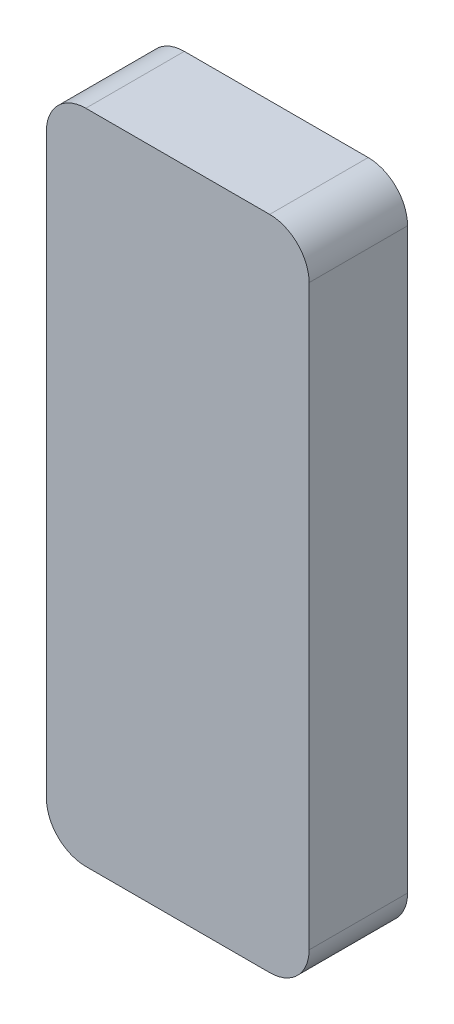
ISO-10303-21;
HEADER;
FILE_DESCRIPTION(('STEP AP214'),'2;1');
FILE_NAME('part.step','',(''),(''),'','','');
FILE_SCHEMA(('AUTOMOTIVE_DESIGN { 1 0 10303 214 1 1 1 1 }'));
ENDSEC;
DATA;
#1=APPLICATION_CONTEXT('core data for automotive mechanical design processes');
#2=APPLICATION_PROTOCOL_DEFINITION('international standard','automotive_design',2000,#1);
#3=PRODUCT_CONTEXT('',#1,'mechanical');
#4=PRODUCT('Part','Part','',(#3));
#5=PRODUCT_RELATED_PRODUCT_CATEGORY('part','',(#4));
#6=PRODUCT_DEFINITION_FORMATION('','',#4);
#7=PRODUCT_DEFINITION_CONTEXT('part definition',#1,'design');
#8=PRODUCT_DEFINITION('design','',#6,#7);
#9=PRODUCT_DEFINITION_SHAPE('','',#8);
#10=(LENGTH_UNIT() NAMED_UNIT(*) SI_UNIT(.MILLI.,.METRE.));
#11=(NAMED_UNIT(*) PLANE_ANGLE_UNIT() SI_UNIT($,.RADIAN.));
#12=(NAMED_UNIT(*) SI_UNIT($,.STERADIAN.) SOLID_ANGLE_UNIT());
#13=UNCERTAINTY_MEASURE_WITH_UNIT(LENGTH_MEASURE(1.E-05),#10,'distance_accuracy_value','');
#14=(GEOMETRIC_REPRESENTATION_CONTEXT(3) GLOBAL_UNCERTAINTY_ASSIGNED_CONTEXT((#13)) GLOBAL_UNIT_ASSIGNED_CONTEXT((#10,
#11,#12)) REPRESENTATION_CONTEXT('',''));
#15=CARTESIAN_POINT('',(0.,0.,0.));
#16=DIRECTION('',(0.,0.,1.));
#17=DIRECTION('',(1.,0.,0.));
#18=AXIS2_PLACEMENT_3D('',#15,#16,#17);
#19=CARTESIAN_POINT('',(6.,6.,15.));
#20=DIRECTION('',(0.,0.,-1.));
#21=DIRECTION('',(-1.,0.,0.));
#22=AXIS2_PLACEMENT_3D('',#19,#20,#21);
#23=CYLINDRICAL_SURFACE('',#22,6.);
#24=CARTESIAN_POINT('',(6.,6.,0.));
#25=DIRECTION('',(0.,0.,1.));
#26=DIRECTION('',(-1.,0.,0.));
#27=AXIS2_PLACEMENT_3D('',#24,#25,#26);
#28=CIRCLE('',#27,6.);
#29=CARTESIAN_POINT('',(0.,6.00000000000004,0.));
#30=VERTEX_POINT('',#29);
#31=CARTESIAN_POINT('',(6.00000000000004,0.,0.));
#32=VERTEX_POINT('',#31);
#33=EDGE_CURVE('E144',#30,#32,#28,.T.);
#34=ORIENTED_EDGE('',*,*,#33,.T.);
#35=DIRECTION('',(0.,0.,-1.));
#36=VECTOR('',#35,1.);
#37=CARTESIAN_POINT('',(6.00000000000004,0.,15.));
#38=LINE('',#37,#36);
#39=CARTESIAN_POINT('',(6.00000000000004,0.,15.));
#40=VERTEX_POINT('',#39);
#41=EDGE_CURVE('E11',#40,#32,#38,.T.);
#42=ORIENTED_EDGE('',*,*,#41,.F.);
#43=CARTESIAN_POINT('',(6.,6.,15.));
#44=DIRECTION('',(0.,0.,1.));
#45=DIRECTION('',(-1.,0.,0.));
#46=AXIS2_PLACEMENT_3D('',#43,#44,#45);
#47=CIRCLE('',#46,6.);
#48=CARTESIAN_POINT('',(0.,6.00000000000004,15.));
#49=VERTEX_POINT('',#48);
#50=EDGE_CURVE('E166',#49,#40,#47,.T.);
#51=ORIENTED_EDGE('',*,*,#50,.F.);
#52=DIRECTION('',(0.,0.,-1.));
#53=VECTOR('',#52,1.);
#54=CARTESIAN_POINT('',(0.,6.00000000000004,15.));
#55=LINE('',#54,#53);
#56=EDGE_CURVE('E140',#49,#30,#55,.T.);
#57=ORIENTED_EDGE('',*,*,#56,.T.);
#58=EDGE_LOOP('',(#34,#42,#51,#57));
#59=FACE_BOUND('',#58,.T.);
#60=ADVANCED_FACE('F43',(#59),#23,.T.);
#61=CARTESIAN_POINT('',(6.00000000000004,0.,15.));
#62=DIRECTION('',(0.,1.,0.));
#63=DIRECTION('',(0.,0.,1.));
#64=AXIS2_PLACEMENT_3D('',#61,#62,#63);
#65=PLANE('',#64);
#66=DIRECTION('',(1.,0.,0.));
#67=VECTOR('',#66,1.);
#68=CARTESIAN_POINT('',(6.00000000000004,0.,0.));
#69=LINE('',#68,#67);
#70=CARTESIAN_POINT('',(34.,0.,0.));
#71=VERTEX_POINT('',#70);
#72=EDGE_CURVE('E148',#32,#71,#69,.T.);
#73=ORIENTED_EDGE('',*,*,#72,.T.);
#74=DIRECTION('',(0.,0.,-1.));
#75=VECTOR('',#74,1.);
#76=CARTESIAN_POINT('',(34.,0.,15.));
#77=LINE('',#76,#75);
#78=CARTESIAN_POINT('',(34.,0.,15.));
#79=VERTEX_POINT('',#78);
#80=EDGE_CURVE('E52',#79,#71,#77,.T.);
#81=ORIENTED_EDGE('',*,*,#80,.F.);
#82=DIRECTION('',(1.,0.,0.));
#83=VECTOR('',#82,1.);
#84=CARTESIAN_POINT('',(6.00000000000004,0.,15.));
#85=LINE('',#84,#83);
#86=EDGE_CURVE('E103',#40,#79,#85,.T.);
#87=ORIENTED_EDGE('',*,*,#86,.F.);
#88=ORIENTED_EDGE('',*,*,#41,.T.);
#89=EDGE_LOOP('',(#73,#81,#87,#88));
#90=FACE_BOUND('',#89,.T.);
#91=ADVANCED_FACE('F212',(#90),#65,.F.);
#92=CARTESIAN_POINT('',(34.,6.,15.));
#93=DIRECTION('',(0.,0.,-1.));
#94=DIRECTION('',(-1.,0.,0.));
#95=AXIS2_PLACEMENT_3D('',#92,#93,#94);
#96=CYLINDRICAL_SURFACE('',#95,6.);
#97=CARTESIAN_POINT('',(34.,6.,0.));
#98=DIRECTION('',(0.,0.,1.));
#99=DIRECTION('',(1.,0.,0.));
#100=AXIS2_PLACEMENT_3D('',#97,#98,#99);
#101=CIRCLE('',#100,6.);
#102=CARTESIAN_POINT('',(40.,6.,0.));
#103=VERTEX_POINT('',#102);
#104=EDGE_CURVE('E151',#71,#103,#101,.T.);
#105=ORIENTED_EDGE('',*,*,#104,.T.);
#106=DIRECTION('',(0.,0.,-1.));
#107=VECTOR('',#106,1.);
#108=CARTESIAN_POINT('',(40.,6.,15.));
#109=LINE('',#108,#107);
#110=CARTESIAN_POINT('',(40.,6.,15.));
#111=VERTEX_POINT('',#110);
#112=EDGE_CURVE('E177',#111,#103,#109,.T.);
#113=ORIENTED_EDGE('',*,*,#112,.F.);
#114=CARTESIAN_POINT('',(34.,6.,15.));
#115=DIRECTION('',(0.,0.,1.));
#116=DIRECTION('',(1.,0.,0.));
#117=AXIS2_PLACEMENT_3D('',#114,#115,#116);
#118=CIRCLE('',#117,6.);
#119=EDGE_CURVE('E187',#79,#111,#118,.T.);
#120=ORIENTED_EDGE('',*,*,#119,.F.);
#121=ORIENTED_EDGE('',*,*,#80,.T.);
#122=EDGE_LOOP('',(#105,#113,#120,#121));
#123=FACE_BOUND('',#122,.T.);
#124=ADVANCED_FACE('F185',(#123),#96,.T.);
#125=CARTESIAN_POINT('',(40.,6.,15.));
#126=DIRECTION('',(-1.,0.,0.));
#127=DIRECTION('',(0.,0.,1.));
#128=AXIS2_PLACEMENT_3D('',#125,#126,#127);
#129=PLANE('',#128);
#130=DIRECTION('',(0.,1.,0.));
#131=VECTOR('',#130,1.);
#132=CARTESIAN_POINT('',(40.,6.,0.));
#133=LINE('',#132,#131);
#134=CARTESIAN_POINT('',(40.,94.,0.));
#135=VERTEX_POINT('',#134);
#136=EDGE_CURVE('E154',#103,#135,#133,.T.);
#137=ORIENTED_EDGE('',*,*,#136,.T.);
#138=DIRECTION('',(0.,0.,-1.));
#139=VECTOR('',#138,1.);
#140=CARTESIAN_POINT('',(40.,94.,15.));
#141=LINE('',#140,#139);
#142=CARTESIAN_POINT('',(40.,94.,15.));
#143=VERTEX_POINT('',#142);
#144=EDGE_CURVE('E173',#143,#135,#141,.T.);
#145=ORIENTED_EDGE('',*,*,#144,.F.);
#146=DIRECTION('',(0.,1.,0.));
#147=VECTOR('',#146,1.);
#148=CARTESIAN_POINT('',(40.,6.,15.));
#149=LINE('',#148,#147);
#150=EDGE_CURVE('E200',#111,#143,#149,.T.);
#151=ORIENTED_EDGE('',*,*,#150,.F.);
#152=ORIENTED_EDGE('',*,*,#112,.T.);
#153=EDGE_LOOP('',(#137,#145,#151,#152));
#154=FACE_BOUND('',#153,.T.);
#155=ADVANCED_FACE('F195',(#154),#129,.F.);
#156=CARTESIAN_POINT('',(34.,94.,15.));
#157=DIRECTION('',(0.,0.,-1.));
#158=DIRECTION('',(-1.,0.,0.));
#159=AXIS2_PLACEMENT_3D('',#156,#157,#158);
#160=CYLINDRICAL_SURFACE('',#159,6.00000000000001);
#161=CARTESIAN_POINT('',(34.,94.,0.));
#162=DIRECTION('',(0.,0.,1.));
#163=DIRECTION('',(-1.,0.,0.));
#164=AXIS2_PLACEMENT_3D('',#161,#162,#163);
#165=CIRCLE('',#164,6.00000000000001);
#166=CARTESIAN_POINT('',(34.,100.,0.));
#167=VERTEX_POINT('',#166);
#168=EDGE_CURVE('E157',#135,#167,#165,.T.);
#169=ORIENTED_EDGE('',*,*,#168,.T.);
#170=DIRECTION('',(0.,0.,-1.));
#171=VECTOR('',#170,1.);
#172=CARTESIAN_POINT('',(34.,100.,15.));
#173=LINE('',#172,#171);
#174=CARTESIAN_POINT('',(34.,100.,15.));
#175=VERTEX_POINT('',#174);
#176=EDGE_CURVE('E133',#175,#167,#173,.T.);
#177=ORIENTED_EDGE('',*,*,#176,.F.);
#178=CARTESIAN_POINT('',(34.,94.,15.));
#179=DIRECTION('',(0.,0.,1.));
#180=DIRECTION('',(-1.,0.,0.));
#181=AXIS2_PLACEMENT_3D('',#178,#179,#180);
#182=CIRCLE('',#181,6.00000000000001);
#183=EDGE_CURVE('E122',#143,#175,#182,.T.);
#184=ORIENTED_EDGE('',*,*,#183,.F.);
#185=ORIENTED_EDGE('',*,*,#144,.T.);
#186=EDGE_LOOP('',(#169,#177,#184,#185));
#187=FACE_BOUND('',#186,.T.);
#188=ADVANCED_FACE('F198',(#187),#160,.T.);
#189=CARTESIAN_POINT('',(6.,100.,15.));
#190=DIRECTION('',(0.,-1.,0.));
#191=DIRECTION('',(0.,0.,-1.));
#192=AXIS2_PLACEMENT_3D('',#189,#190,#191);
#193=PLANE('',#192);
#194=DIRECTION('',(-1.,0.,0.));
#195=VECTOR('',#194,1.);
#196=CARTESIAN_POINT('',(6.,100.,0.));
#197=LINE('',#196,#195);
#198=CARTESIAN_POINT('',(6.,100.,0.));
#199=VERTEX_POINT('',#198);
#200=EDGE_CURVE('E131',#167,#199,#197,.T.);
#201=ORIENTED_EDGE('',*,*,#200,.T.);
#202=DIRECTION('',(0.,0.,-1.));
#203=VECTOR('',#202,1.);
#204=CARTESIAN_POINT('',(6.,100.,15.));
#205=LINE('',#204,#203);
#206=CARTESIAN_POINT('',(6.,100.,15.));
#207=VERTEX_POINT('',#206);
#208=EDGE_CURVE('E128',#207,#199,#205,.T.);
#209=ORIENTED_EDGE('',*,*,#208,.F.);
#210=DIRECTION('',(-1.,0.,0.));
#211=VECTOR('',#210,1.);
#212=CARTESIAN_POINT('',(6.,100.,15.));
#213=LINE('',#212,#211);
#214=EDGE_CURVE('E116',#175,#207,#213,.T.);
#215=ORIENTED_EDGE('',*,*,#214,.F.);
#216=ORIENTED_EDGE('',*,*,#176,.T.);
#217=EDGE_LOOP('',(#201,#209,#215,#216));
#218=FACE_BOUND('',#217,.T.);
#219=ADVANCED_FACE('F129',(#218),#193,.F.);
#220=CARTESIAN_POINT('',(6.,94.,15.));
#221=DIRECTION('',(0.,0.,-1.));
#222=DIRECTION('',(-1.,0.,0.));
#223=AXIS2_PLACEMENT_3D('',#220,#221,#222);
#224=CYLINDRICAL_SURFACE('',#223,6.);
#225=CARTESIAN_POINT('',(6.,94.,0.));
#226=DIRECTION('',(0.,0.,1.));
#227=DIRECTION('',(-1.,0.,0.));
#228=AXIS2_PLACEMENT_3D('',#225,#226,#227);
#229=CIRCLE('',#228,6.);
#230=CARTESIAN_POINT('',(0.,94.,0.));
#231=VERTEX_POINT('',#230);
#232=EDGE_CURVE('E89',#199,#231,#229,.T.);
#233=ORIENTED_EDGE('',*,*,#232,.T.);
#234=DIRECTION('',(0.,0.,-1.));
#235=VECTOR('',#234,1.);
#236=CARTESIAN_POINT('',(0.,94.,15.));
#237=LINE('',#236,#235);
#238=CARTESIAN_POINT('',(0.,94.,15.));
#239=VERTEX_POINT('',#238);
#240=EDGE_CURVE('E134',#239,#231,#237,.T.);
#241=ORIENTED_EDGE('',*,*,#240,.F.);
#242=CARTESIAN_POINT('',(6.,94.,15.));
#243=DIRECTION('',(0.,0.,1.));
#244=DIRECTION('',(-1.,0.,0.));
#245=AXIS2_PLACEMENT_3D('',#242,#243,#244);
#246=CIRCLE('',#245,6.);
#247=EDGE_CURVE('E120',#207,#239,#246,.T.);
#248=ORIENTED_EDGE('',*,*,#247,.F.);
#249=ORIENTED_EDGE('',*,*,#208,.T.);
#250=EDGE_LOOP('',(#233,#241,#248,#249));
#251=FACE_BOUND('',#250,.T.);
#252=ADVANCED_FACE('F136',(#251),#224,.T.);
#253=CARTESIAN_POINT('',(0.,6.00000000000004,15.));
#254=DIRECTION('',(1.,0.,0.));
#255=DIRECTION('',(0.,0.,-1.));
#256=AXIS2_PLACEMENT_3D('',#253,#254,#255);
#257=PLANE('',#256);
#258=DIRECTION('',(0.,-1.,0.));
#259=VECTOR('',#258,1.);
#260=CARTESIAN_POINT('',(0.,6.00000000000004,0.));
#261=LINE('',#260,#259);
#262=EDGE_CURVE('E95',#231,#30,#261,.T.);
#263=ORIENTED_EDGE('',*,*,#262,.T.);
#264=ORIENTED_EDGE('',*,*,#56,.F.);
#265=DIRECTION('',(0.,-1.,0.));
#266=VECTOR('',#265,1.);
#267=CARTESIAN_POINT('',(0.,6.00000000000004,15.));
#268=LINE('',#267,#266);
#269=EDGE_CURVE('E60',#239,#49,#268,.T.);
#270=ORIENTED_EDGE('',*,*,#269,.F.);
#271=ORIENTED_EDGE('',*,*,#240,.T.);
#272=EDGE_LOOP('',(#263,#264,#270,#271));
#273=FACE_BOUND('',#272,.T.);
#274=ADVANCED_FACE('F228',(#273),#257,.F.);
#275=CARTESIAN_POINT('',(6.,6.,15.));
#276=DIRECTION('',(0.,0.,-1.));
#277=DIRECTION('',(-1.,0.,0.));
#278=AXIS2_PLACEMENT_3D('',#275,#276,#277);
#279=PLANE('',#278);
#280=ORIENTED_EDGE('',*,*,#50,.T.);
#281=ORIENTED_EDGE('',*,*,#86,.T.);
#282=ORIENTED_EDGE('',*,*,#119,.T.);
#283=ORIENTED_EDGE('',*,*,#150,.T.);
#284=ORIENTED_EDGE('',*,*,#183,.T.);
#285=ORIENTED_EDGE('',*,*,#214,.T.);
#286=ORIENTED_EDGE('',*,*,#247,.T.);
#287=ORIENTED_EDGE('',*,*,#269,.T.);
#288=EDGE_LOOP('',(#280,#281,#282,#283,#284,#285,#286,#287));
#289=FACE_BOUND('',#288,.T.);
#290=ADVANCED_FACE('F118',(#289),#279,.F.);
#291=CARTESIAN_POINT('',(6.,6.,0.));
#292=DIRECTION('',(0.,0.,-1.));
#293=DIRECTION('',(-1.,0.,0.));
#294=AXIS2_PLACEMENT_3D('',#291,#292,#293);
#295=PLANE('',#294);
#296=ORIENTED_EDGE('',*,*,#33,.F.);
#297=ORIENTED_EDGE('',*,*,#262,.F.);
#298=ORIENTED_EDGE('',*,*,#232,.F.);
#299=ORIENTED_EDGE('',*,*,#200,.F.);
#300=ORIENTED_EDGE('',*,*,#168,.F.);
#301=ORIENTED_EDGE('',*,*,#136,.F.);
#302=ORIENTED_EDGE('',*,*,#104,.F.);
#303=ORIENTED_EDGE('',*,*,#72,.F.);
#304=EDGE_LOOP('',(#296,#297,#298,#299,#300,#301,#302,#303));
#305=FACE_BOUND('',#304,.T.);
#306=ADVANCED_FACE('F191',(#305),#295,.T.);
#307=CLOSED_SHELL('',(#60,#91,#124,#155,#188,#219,#252,#274,#290,#306));
#308=MANIFOLD_SOLID_BREP('B2',#307);
#309=ADVANCED_BREP_SHAPE_REPRESENTATION('',(#18,#308),#14);
#310=SHAPE_DEFINITION_REPRESENTATION(#9,#309);
ENDSEC;
END-ISO-10303-21;
